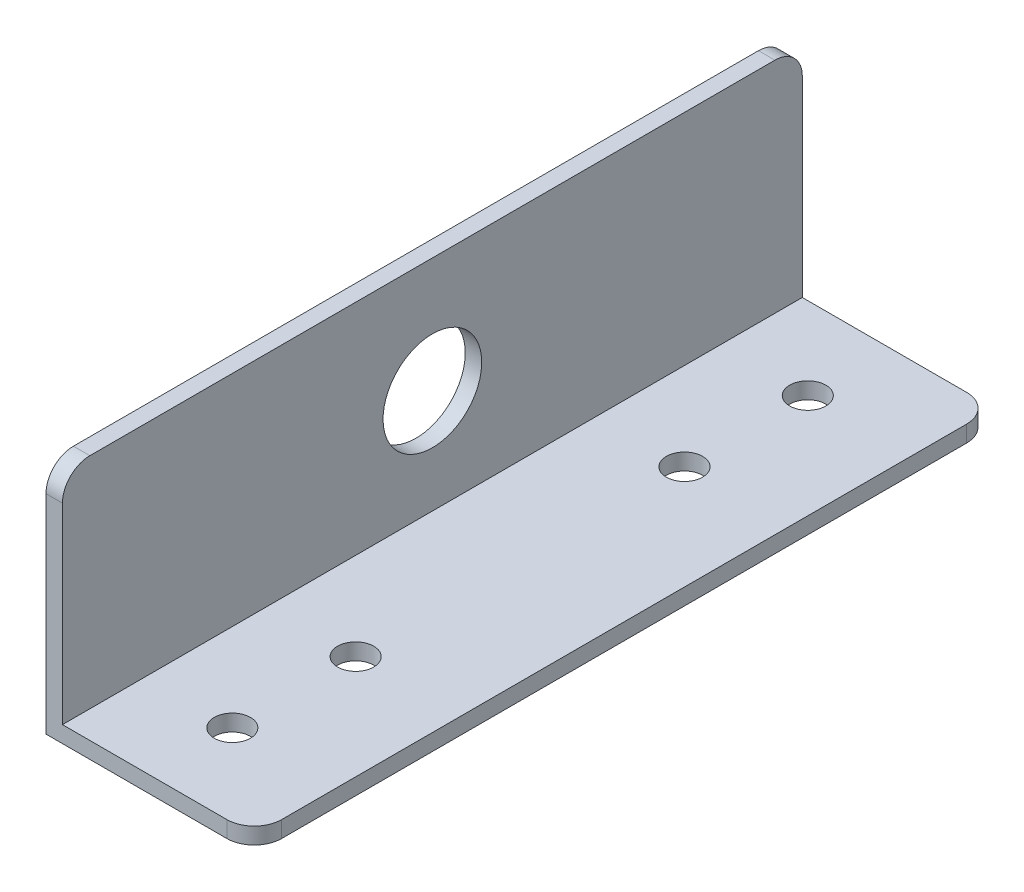
ISO-10303-21;
HEADER;
FILE_DESCRIPTION(('STEP AP214'),'2;1');
FILE_NAME('part.step','',(''),(''),'','','');
FILE_SCHEMA(('AUTOMOTIVE_DESIGN { 1 0 10303 214 1 1 1 1 }'));
ENDSEC;
DATA;
#1=APPLICATION_CONTEXT('core data for automotive mechanical design processes');
#2=APPLICATION_PROTOCOL_DEFINITION('international standard','automotive_design',2000,#1);
#3=PRODUCT_CONTEXT('',#1,'mechanical');
#4=PRODUCT('Part','Part','',(#3));
#5=PRODUCT_RELATED_PRODUCT_CATEGORY('part','',(#4));
#6=PRODUCT_DEFINITION_FORMATION('','',#4);
#7=PRODUCT_DEFINITION_CONTEXT('part definition',#1,'design');
#8=PRODUCT_DEFINITION('design','',#6,#7);
#9=PRODUCT_DEFINITION_SHAPE('','',#8);
#10=(LENGTH_UNIT() NAMED_UNIT(*) SI_UNIT(.MILLI.,.METRE.));
#11=(NAMED_UNIT(*) PLANE_ANGLE_UNIT() SI_UNIT($,.RADIAN.));
#12=(NAMED_UNIT(*) SI_UNIT($,.STERADIAN.) SOLID_ANGLE_UNIT());
#13=UNCERTAINTY_MEASURE_WITH_UNIT(LENGTH_MEASURE(1.E-05),#10,'distance_accuracy_value','');
#14=(GEOMETRIC_REPRESENTATION_CONTEXT(3) GLOBAL_UNCERTAINTY_ASSIGNED_CONTEXT((#13)) GLOBAL_UNIT_ASSIGNED_CONTEXT((#10,
#11,#12)) REPRESENTATION_CONTEXT('',''));
#15=CARTESIAN_POINT('',(0.,0.,0.));
#16=DIRECTION('',(0.,0.,1.));
#17=DIRECTION('',(1.,0.,0.));
#18=AXIS2_PLACEMENT_3D('',#15,#16,#17);
#19=CARTESIAN_POINT('',(0.,86.,135.));
#20=DIRECTION('',(1.,0.,0.));
#21=DIRECTION('',(0.,1.,0.));
#22=AXIS2_PLACEMENT_3D('',#19,#20,#21);
#23=PLANE('',#22);
#24=CARTESIAN_POINT('',(0.,44.,0.));
#25=DIRECTION('',(1.,0.,0.));
#26=DIRECTION('',(0.,1.,0.));
#27=AXIS2_PLACEMENT_3D('',#24,#25,#26);
#28=CIRCLE('',#27,18.);
#29=CARTESIAN_POINT('',(0.,62.,0.));
#30=VERTEX_POINT('',#29);
#31=EDGE_CURVE('E243',#30,#30,#28,.T.);
#32=ORIENTED_EDGE('',*,*,#31,.T.);
#33=EDGE_LOOP('',(#32));
#34=FACE_BOUND('',#33,.T.);
#35=DIRECTION('',(0.,-1.,0.));
#36=VECTOR('',#35,1.);
#37=CARTESIAN_POINT('',(0.,86.,135.));
#38=LINE('',#37,#36);
#39=CARTESIAN_POINT('',(0.,76.,135.));
#40=VERTEX_POINT('',#39);
#41=CARTESIAN_POINT('',(0.,0.,135.));
#42=VERTEX_POINT('',#41);
#43=EDGE_CURVE('E125',#40,#42,#38,.T.);
#44=ORIENTED_EDGE('',*,*,#43,.F.);
#45=CARTESIAN_POINT('',(0.,76.,125.));
#46=DIRECTION('',(1.,0.,0.));
#47=DIRECTION('',(0.,1.,0.));
#48=AXIS2_PLACEMENT_3D('',#45,#46,#47);
#49=CIRCLE('',#48,10.);
#50=CARTESIAN_POINT('',(0.,86.,125.));
#51=VERTEX_POINT('',#50);
#52=EDGE_CURVE('E188',#40,#51,#49,.F.);
#53=ORIENTED_EDGE('',*,*,#52,.T.);
#54=DIRECTION('',(0.,0.,-1.));
#55=VECTOR('',#54,1.);
#56=CARTESIAN_POINT('',(0.,86.,135.));
#57=LINE('',#56,#55);
#58=CARTESIAN_POINT('',(0.,86.,-125.));
#59=VERTEX_POINT('',#58);
#60=EDGE_CURVE('E232',#51,#59,#57,.T.);
#61=ORIENTED_EDGE('',*,*,#60,.T.);
#62=CARTESIAN_POINT('',(0.,76.,-125.));
#63=DIRECTION('',(1.,0.,0.));
#64=DIRECTION('',(0.,1.,0.));
#65=AXIS2_PLACEMENT_3D('',#62,#63,#64);
#66=CIRCLE('',#65,10.);
#67=CARTESIAN_POINT('',(0.,76.,-135.));
#68=VERTEX_POINT('',#67);
#69=EDGE_CURVE('E185',#59,#68,#66,.F.);
#70=ORIENTED_EDGE('',*,*,#69,.T.);
#71=DIRECTION('',(0.,-1.,0.));
#72=VECTOR('',#71,1.);
#73=CARTESIAN_POINT('',(0.,86.,-135.));
#74=LINE('',#73,#72);
#75=CARTESIAN_POINT('',(0.,0.,-135.));
#76=VERTEX_POINT('',#75);
#77=EDGE_CURVE('E150',#68,#76,#74,.T.);
#78=ORIENTED_EDGE('',*,*,#77,.T.);
#79=DIRECTION('',(0.,0.,-1.));
#80=VECTOR('',#79,1.);
#81=CARTESIAN_POINT('',(0.,0.,135.));
#82=LINE('',#81,#80);
#83=EDGE_CURVE('E144',#42,#76,#82,.T.);
#84=ORIENTED_EDGE('',*,*,#83,.F.);
#85=EDGE_LOOP('',(#44,#53,#61,#70,#78,#84));
#86=FACE_BOUND('',#85,.T.);
#87=ADVANCED_FACE('F45',(#34,#86),#23,.F.);
#88=CARTESIAN_POINT('',(0.,0.,135.));
#89=DIRECTION('',(0.,1.,0.));
#90=DIRECTION('',(0.,0.,1.));
#91=AXIS2_PLACEMENT_3D('',#88,#89,#90);
#92=PLANE('',#91);
#93=CARTESIAN_POINT('',(37.9999999999999,0.,105.));
#94=DIRECTION('',(0.,1.,0.));
#95=DIRECTION('',(1.,0.,0.));
#96=AXIS2_PLACEMENT_3D('',#93,#94,#95);
#97=CIRCLE('',#96,6.6);
#98=CARTESIAN_POINT('',(44.5999999999999,0.,105.));
#99=VERTEX_POINT('',#98);
#100=EDGE_CURVE('E268',#99,#99,#97,.T.);
#101=ORIENTED_EDGE('',*,*,#100,.T.);
#102=EDGE_LOOP('',(#101));
#103=FACE_BOUND('',#102,.T.);
#104=CARTESIAN_POINT('',(37.9999999999999,0.,60.));
#105=DIRECTION('',(0.,1.,0.));
#106=DIRECTION('',(-1.,0.,0.));
#107=AXIS2_PLACEMENT_3D('',#104,#105,#106);
#108=CIRCLE('',#107,6.6);
#109=CARTESIAN_POINT('',(31.3999999999999,0.,60.));
#110=VERTEX_POINT('',#109);
#111=EDGE_CURVE('E276',#110,#110,#108,.T.);
#112=ORIENTED_EDGE('',*,*,#111,.T.);
#113=EDGE_LOOP('',(#112));
#114=FACE_BOUND('',#113,.T.);
#115=CARTESIAN_POINT('',(37.9999999999999,0.,-105.));
#116=DIRECTION('',(0.,1.,0.));
#117=DIRECTION('',(-1.,0.,0.));
#118=AXIS2_PLACEMENT_3D('',#115,#116,#117);
#119=CIRCLE('',#118,6.6);
#120=CARTESIAN_POINT('',(31.3999999999999,0.,-105.));
#121=VERTEX_POINT('',#120);
#122=EDGE_CURVE('E260',#121,#121,#119,.T.);
#123=ORIENTED_EDGE('',*,*,#122,.T.);
#124=EDGE_LOOP('',(#123));
#125=FACE_BOUND('',#124,.T.);
#126=CARTESIAN_POINT('',(37.9999999999999,0.,-60.));
#127=DIRECTION('',(0.,1.,0.));
#128=DIRECTION('',(1.,0.,0.));
#129=AXIS2_PLACEMENT_3D('',#126,#127,#128);
#130=CIRCLE('',#129,6.6);
#131=CARTESIAN_POINT('',(44.5999999999999,0.,-60.));
#132=VERTEX_POINT('',#131);
#133=EDGE_CURVE('E252',#132,#132,#130,.T.);
#134=ORIENTED_EDGE('',*,*,#133,.T.);
#135=EDGE_LOOP('',(#134));
#136=FACE_BOUND('',#135,.T.);
#137=DIRECTION('',(0.,0.,-1.));
#138=VECTOR('',#137,1.);
#139=CARTESIAN_POINT('',(76.,0.,135.));
#140=LINE('',#139,#138);
#141=CARTESIAN_POINT('',(76.,0.,125.));
#142=VERTEX_POINT('',#141);
#143=CARTESIAN_POINT('',(76.,0.,-125.));
#144=VERTEX_POINT('',#143);
#145=EDGE_CURVE('E153',#142,#144,#140,.T.);
#146=ORIENTED_EDGE('',*,*,#145,.F.);
#147=CARTESIAN_POINT('',(66.,0.,125.));
#148=DIRECTION('',(0.,1.,0.));
#149=DIRECTION('',(0.,0.,1.));
#150=AXIS2_PLACEMENT_3D('',#147,#148,#149);
#151=CIRCLE('',#150,10.);
#152=CARTESIAN_POINT('',(66.,0.,135.));
#153=VERTEX_POINT('',#152);
#154=EDGE_CURVE('E146',#142,#153,#151,.F.);
#155=ORIENTED_EDGE('',*,*,#154,.T.);
#156=DIRECTION('',(1.,0.,0.));
#157=VECTOR('',#156,1.);
#158=CARTESIAN_POINT('',(0.,0.,135.));
#159=LINE('',#158,#157);
#160=EDGE_CURVE('E129',#42,#153,#159,.T.);
#161=ORIENTED_EDGE('',*,*,#160,.F.);
#162=ORIENTED_EDGE('',*,*,#83,.T.);
#163=DIRECTION('',(1.,0.,0.));
#164=VECTOR('',#163,1.);
#165=CARTESIAN_POINT('',(0.,0.,-135.));
#166=LINE('',#165,#164);
#167=CARTESIAN_POINT('',(66.,0.,-135.));
#168=VERTEX_POINT('',#167);
#169=EDGE_CURVE('E207',#76,#168,#166,.T.);
#170=ORIENTED_EDGE('',*,*,#169,.T.);
#171=CARTESIAN_POINT('',(66.,0.,-125.));
#172=DIRECTION('',(0.,1.,0.));
#173=DIRECTION('',(0.,0.,1.));
#174=AXIS2_PLACEMENT_3D('',#171,#172,#173);
#175=CIRCLE('',#174,10.);
#176=EDGE_CURVE('E180',#168,#144,#175,.F.);
#177=ORIENTED_EDGE('',*,*,#176,.T.);
#178=EDGE_LOOP('',(#146,#155,#161,#162,#170,#177));
#179=FACE_BOUND('',#178,.T.);
#180=ADVANCED_FACE('F142',(#103,#114,#125,#136,#179),#92,.F.);
#181=CARTESIAN_POINT('',(76.,0.,135.));
#182=DIRECTION('',(-1.,0.,0.));
#183=DIRECTION('',(0.,0.,1.));
#184=AXIS2_PLACEMENT_3D('',#181,#182,#183);
#185=PLANE('',#184);
#186=DIRECTION('',(0.,0.,-1.));
#187=VECTOR('',#186,1.);
#188=CARTESIAN_POINT('',(76.,6.,135.));
#189=LINE('',#188,#187);
#190=CARTESIAN_POINT('',(76.,6.,125.));
#191=VERTEX_POINT('',#190);
#192=CARTESIAN_POINT('',(76.,6.,-125.));
#193=VERTEX_POINT('',#192);
#194=EDGE_CURVE('E161',#191,#193,#189,.T.);
#195=ORIENTED_EDGE('',*,*,#194,.F.);
#196=DIRECTION('',(0.,1.,0.));
#197=VECTOR('',#196,1.);
#198=CARTESIAN_POINT('',(76.,0.,125.));
#199=LINE('',#198,#197);
#200=EDGE_CURVE('E177',#191,#142,#199,.F.);
#201=ORIENTED_EDGE('',*,*,#200,.T.);
#202=ORIENTED_EDGE('',*,*,#145,.T.);
#203=DIRECTION('',(0.,1.,0.));
#204=VECTOR('',#203,1.);
#205=CARTESIAN_POINT('',(76.,0.,-125.));
#206=LINE('',#205,#204);
#207=EDGE_CURVE('E173',#144,#193,#206,.T.);
#208=ORIENTED_EDGE('',*,*,#207,.T.);
#209=EDGE_LOOP('',(#195,#201,#202,#208));
#210=FACE_BOUND('',#209,.T.);
#211=ADVANCED_FACE('F217',(#210),#185,.F.);
#212=CARTESIAN_POINT('',(76.,6.,135.));
#213=DIRECTION('',(0.,-1.,0.));
#214=DIRECTION('',(1.,0.,0.));
#215=AXIS2_PLACEMENT_3D('',#212,#213,#214);
#216=PLANE('',#215);
#217=CARTESIAN_POINT('',(37.9999999999999,6.,105.));
#218=DIRECTION('',(0.,1.,0.));
#219=DIRECTION('',(1.,0.,0.));
#220=AXIS2_PLACEMENT_3D('',#217,#218,#219);
#221=CIRCLE('',#220,6.6);
#222=CARTESIAN_POINT('',(44.5999999999999,6.,105.));
#223=VERTEX_POINT('',#222);
#224=EDGE_CURVE('E264',#223,#223,#221,.T.);
#225=ORIENTED_EDGE('',*,*,#224,.F.);
#226=EDGE_LOOP('',(#225));
#227=FACE_BOUND('',#226,.T.);
#228=CARTESIAN_POINT('',(37.9999999999999,6.,60.));
#229=DIRECTION('',(0.,1.,0.));
#230=DIRECTION('',(-1.,0.,0.));
#231=AXIS2_PLACEMENT_3D('',#228,#229,#230);
#232=CIRCLE('',#231,6.6);
#233=CARTESIAN_POINT('',(31.3999999999999,6.,60.));
#234=VERTEX_POINT('',#233);
#235=EDGE_CURVE('E272',#234,#234,#232,.T.);
#236=ORIENTED_EDGE('',*,*,#235,.F.);
#237=EDGE_LOOP('',(#236));
#238=FACE_BOUND('',#237,.T.);
#239=CARTESIAN_POINT('',(37.9999999999999,6.,-105.));
#240=DIRECTION('',(0.,1.,0.));
#241=DIRECTION('',(-1.,0.,0.));
#242=AXIS2_PLACEMENT_3D('',#239,#240,#241);
#243=CIRCLE('',#242,6.6);
#244=CARTESIAN_POINT('',(31.3999999999999,6.,-105.));
#245=VERTEX_POINT('',#244);
#246=EDGE_CURVE('E280',#245,#245,#243,.T.);
#247=ORIENTED_EDGE('',*,*,#246,.F.);
#248=EDGE_LOOP('',(#247));
#249=FACE_BOUND('',#248,.T.);
#250=CARTESIAN_POINT('',(37.9999999999999,6.,-60.));
#251=DIRECTION('',(0.,1.,0.));
#252=DIRECTION('',(1.,0.,0.));
#253=AXIS2_PLACEMENT_3D('',#250,#251,#252);
#254=CIRCLE('',#253,6.6);
#255=CARTESIAN_POINT('',(44.5999999999999,6.,-60.));
#256=VERTEX_POINT('',#255);
#257=EDGE_CURVE('E256',#256,#256,#254,.T.);
#258=ORIENTED_EDGE('',*,*,#257,.F.);
#259=EDGE_LOOP('',(#258));
#260=FACE_BOUND('',#259,.T.);
#261=DIRECTION('',(-1.,0.,0.));
#262=VECTOR('',#261,1.);
#263=CARTESIAN_POINT('',(76.,6.,135.));
#264=LINE('',#263,#262);
#265=CARTESIAN_POINT('',(66.,6.,135.));
#266=VERTEX_POINT('',#265);
#267=CARTESIAN_POINT('',(6.,5.99999999999999,135.));
#268=VERTEX_POINT('',#267);
#269=EDGE_CURVE('E148',#266,#268,#264,.T.);
#270=ORIENTED_EDGE('',*,*,#269,.F.);
#271=CARTESIAN_POINT('',(66.,6.,125.));
#272=DIRECTION('',(0.,-1.,0.));
#273=DIRECTION('',(1.,0.,0.));
#274=AXIS2_PLACEMENT_3D('',#271,#272,#273);
#275=CIRCLE('',#274,10.);
#276=EDGE_CURVE('E170',#266,#191,#275,.F.);
#277=ORIENTED_EDGE('',*,*,#276,.T.);
#278=ORIENTED_EDGE('',*,*,#194,.T.);
#279=CARTESIAN_POINT('',(66.,6.,-125.));
#280=DIRECTION('',(0.,-1.,0.));
#281=DIRECTION('',(1.,0.,0.));
#282=AXIS2_PLACEMENT_3D('',#279,#280,#281);
#283=CIRCLE('',#282,10.);
#284=CARTESIAN_POINT('',(66.,6.,-135.));
#285=VERTEX_POINT('',#284);
#286=EDGE_CURVE('E167',#193,#285,#283,.F.);
#287=ORIENTED_EDGE('',*,*,#286,.T.);
#288=DIRECTION('',(-1.,0.,0.));
#289=VECTOR('',#288,1.);
#290=CARTESIAN_POINT('',(76.,6.,-135.));
#291=LINE('',#290,#289);
#292=CARTESIAN_POINT('',(6.,5.99999999999999,-135.));
#293=VERTEX_POINT('',#292);
#294=EDGE_CURVE('E208',#285,#293,#291,.T.);
#295=ORIENTED_EDGE('',*,*,#294,.T.);
#296=DIRECTION('',(0.,0.,-1.));
#297=VECTOR('',#296,1.);
#298=CARTESIAN_POINT('',(6.,5.99999999999999,135.));
#299=LINE('',#298,#297);
#300=EDGE_CURVE('E223',#268,#293,#299,.T.);
#301=ORIENTED_EDGE('',*,*,#300,.F.);
#302=EDGE_LOOP('',(#270,#277,#278,#287,#295,#301));
#303=FACE_BOUND('',#302,.T.);
#304=ADVANCED_FACE('F221',(#227,#238,#249,#260,#303),#216,.F.);
#305=CARTESIAN_POINT('',(6.,5.99999999999999,135.));
#306=DIRECTION('',(-1.,0.,0.));
#307=DIRECTION('',(0.,-1.,0.));
#308=AXIS2_PLACEMENT_3D('',#305,#306,#307);
#309=PLANE('',#308);
#310=CARTESIAN_POINT('',(6.,44.,0.));
#311=DIRECTION('',(1.,0.,0.));
#312=DIRECTION('',(0.,1.,0.));
#313=AXIS2_PLACEMENT_3D('',#310,#311,#312);
#314=CIRCLE('',#313,18.);
#315=CARTESIAN_POINT('',(6.,62.,0.));
#316=VERTEX_POINT('',#315);
#317=EDGE_CURVE('E248',#316,#316,#314,.T.);
#318=ORIENTED_EDGE('',*,*,#317,.F.);
#319=EDGE_LOOP('',(#318));
#320=FACE_BOUND('',#319,.T.);
#321=DIRECTION('',(0.,0.,-1.));
#322=VECTOR('',#321,1.);
#323=CARTESIAN_POINT('',(6.,86.,135.));
#324=LINE('',#323,#322);
#325=CARTESIAN_POINT('',(6.,86.,125.));
#326=VERTEX_POINT('',#325);
#327=CARTESIAN_POINT('',(6.,86.,-125.));
#328=VERTEX_POINT('',#327);
#329=EDGE_CURVE('E227',#326,#328,#324,.T.);
#330=ORIENTED_EDGE('',*,*,#329,.F.);
#331=CARTESIAN_POINT('',(6.,76.,125.));
#332=DIRECTION('',(-1.,0.,0.));
#333=DIRECTION('',(0.,-1.,0.));
#334=AXIS2_PLACEMENT_3D('',#331,#332,#333);
#335=CIRCLE('',#334,10.);
#336=CARTESIAN_POINT('',(6.,76.,135.));
#337=VERTEX_POINT('',#336);
#338=EDGE_CURVE('E200',#326,#337,#335,.F.);
#339=ORIENTED_EDGE('',*,*,#338,.T.);
#340=DIRECTION('',(0.,1.,0.));
#341=VECTOR('',#340,1.);
#342=CARTESIAN_POINT('',(6.,5.99999999999999,135.));
#343=LINE('',#342,#341);
#344=EDGE_CURVE('E236',#268,#337,#343,.T.);
#345=ORIENTED_EDGE('',*,*,#344,.F.);
#346=ORIENTED_EDGE('',*,*,#300,.T.);
#347=DIRECTION('',(0.,1.,0.));
#348=VECTOR('',#347,1.);
#349=CARTESIAN_POINT('',(6.,5.99999999999999,-135.));
#350=LINE('',#349,#348);
#351=CARTESIAN_POINT('',(6.,76.,-135.));
#352=VERTEX_POINT('',#351);
#353=EDGE_CURVE('E137',#293,#352,#350,.T.);
#354=ORIENTED_EDGE('',*,*,#353,.T.);
#355=CARTESIAN_POINT('',(6.,76.,-125.));
#356=DIRECTION('',(-1.,0.,0.));
#357=DIRECTION('',(0.,-1.,0.));
#358=AXIS2_PLACEMENT_3D('',#355,#356,#357);
#359=CIRCLE('',#358,10.);
#360=EDGE_CURVE('E66',#352,#328,#359,.F.);
#361=ORIENTED_EDGE('',*,*,#360,.T.);
#362=EDGE_LOOP('',(#330,#339,#345,#346,#354,#361));
#363=FACE_BOUND('',#362,.T.);
#364=ADVANCED_FACE('F301',(#320,#363),#309,.F.);
#365=CARTESIAN_POINT('',(6.,86.,135.));
#366=DIRECTION('',(0.,-1.,0.));
#367=DIRECTION('',(0.,0.,-1.));
#368=AXIS2_PLACEMENT_3D('',#365,#366,#367);
#369=PLANE('',#368);
#370=ORIENTED_EDGE('',*,*,#60,.F.);
#371=DIRECTION('',(-1.,0.,0.));
#372=VECTOR('',#371,1.);
#373=CARTESIAN_POINT('',(6.,86.,125.));
#374=LINE('',#373,#372);
#375=EDGE_CURVE('E195',#51,#326,#374,.F.);
#376=ORIENTED_EDGE('',*,*,#375,.T.);
#377=ORIENTED_EDGE('',*,*,#329,.T.);
#378=DIRECTION('',(-1.,0.,0.));
#379=VECTOR('',#378,1.);
#380=CARTESIAN_POINT('',(6.,86.,-125.));
#381=LINE('',#380,#379);
#382=EDGE_CURVE('E191',#328,#59,#381,.T.);
#383=ORIENTED_EDGE('',*,*,#382,.T.);
#384=EDGE_LOOP('',(#370,#376,#377,#383));
#385=FACE_BOUND('',#384,.T.);
#386=ADVANCED_FACE('F345',(#385),#369,.F.);
#387=CARTESIAN_POINT('',(0.,0.,135.));
#388=DIRECTION('',(0.,0.,1.));
#389=DIRECTION('',(1.,0.,0.));
#390=AXIS2_PLACEMENT_3D('',#387,#388,#389);
#391=PLANE('',#390);
#392=ORIENTED_EDGE('',*,*,#160,.T.);
#393=DIRECTION('',(0.,1.,0.));
#394=VECTOR('',#393,1.);
#395=CARTESIAN_POINT('',(66.,6.,135.));
#396=LINE('',#395,#394);
#397=EDGE_CURVE('E158',#153,#266,#396,.T.);
#398=ORIENTED_EDGE('',*,*,#397,.T.);
#399=ORIENTED_EDGE('',*,*,#269,.T.);
#400=ORIENTED_EDGE('',*,*,#344,.T.);
#401=DIRECTION('',(-1.,0.,0.));
#402=VECTOR('',#401,1.);
#403=CARTESIAN_POINT('',(0.,76.,135.));
#404=LINE('',#403,#402);
#405=EDGE_CURVE('E133',#337,#40,#404,.T.);
#406=ORIENTED_EDGE('',*,*,#405,.T.);
#407=ORIENTED_EDGE('',*,*,#43,.T.);
#408=EDGE_LOOP('',(#392,#398,#399,#400,#406,#407));
#409=FACE_BOUND('',#408,.T.);
#410=ADVANCED_FACE('F127',(#409),#391,.T.);
#411=CARTESIAN_POINT('',(0.,0.,-135.));
#412=DIRECTION('',(0.,0.,1.));
#413=DIRECTION('',(1.,0.,0.));
#414=AXIS2_PLACEMENT_3D('',#411,#412,#413);
#415=PLANE('',#414);
#416=ORIENTED_EDGE('',*,*,#77,.F.);
#417=DIRECTION('',(-1.,0.,0.));
#418=VECTOR('',#417,1.);
#419=CARTESIAN_POINT('',(0.,76.,-135.));
#420=LINE('',#419,#418);
#421=EDGE_CURVE('E11',#68,#352,#420,.F.);
#422=ORIENTED_EDGE('',*,*,#421,.T.);
#423=ORIENTED_EDGE('',*,*,#353,.F.);
#424=ORIENTED_EDGE('',*,*,#294,.F.);
#425=DIRECTION('',(0.,1.,0.));
#426=VECTOR('',#425,1.);
#427=CARTESIAN_POINT('',(66.,0.,-135.));
#428=LINE('',#427,#426);
#429=EDGE_CURVE('E54',#285,#168,#428,.F.);
#430=ORIENTED_EDGE('',*,*,#429,.T.);
#431=ORIENTED_EDGE('',*,*,#169,.F.);
#432=EDGE_LOOP('',(#416,#422,#423,#424,#430,#431));
#433=FACE_BOUND('',#432,.T.);
#434=ADVANCED_FACE('F206',(#433),#415,.F.);
#435=CARTESIAN_POINT('',(0.,44.,0.));
#436=DIRECTION('',(1.,0.,0.));
#437=DIRECTION('',(0.,1.,0.));
#438=AXIS2_PLACEMENT_3D('',#435,#436,#437);
#439=CYLINDRICAL_SURFACE('',#438,18.);
#440=ORIENTED_EDGE('',*,*,#31,.F.);
#441=EDGE_LOOP('',(#440));
#442=FACE_BOUND('',#441,.T.);
#443=ORIENTED_EDGE('',*,*,#317,.T.);
#444=EDGE_LOOP('',(#443));
#445=FACE_BOUND('',#444,.T.);
#446=ADVANCED_FACE('F307',(#442,#445),#439,.F.);
#447=CARTESIAN_POINT('',(37.9999999999999,0.,-60.));
#448=DIRECTION('',(0.,1.,0.));
#449=DIRECTION('',(-1.,0.,0.));
#450=AXIS2_PLACEMENT_3D('',#447,#448,#449);
#451=CYLINDRICAL_SURFACE('',#450,6.6);
#452=ORIENTED_EDGE('',*,*,#133,.F.);
#453=EDGE_LOOP('',(#452));
#454=FACE_BOUND('',#453,.T.);
#455=ORIENTED_EDGE('',*,*,#257,.T.);
#456=EDGE_LOOP('',(#455));
#457=FACE_BOUND('',#456,.T.);
#458=ADVANCED_FACE('F295',(#454,#457),#451,.F.);
#459=CARTESIAN_POINT('',(37.9999999999999,0.,-105.));
#460=DIRECTION('',(0.,1.,0.));
#461=DIRECTION('',(-1.,0.,0.));
#462=AXIS2_PLACEMENT_3D('',#459,#460,#461);
#463=CYLINDRICAL_SURFACE('',#462,6.6);
#464=ORIENTED_EDGE('',*,*,#122,.F.);
#465=EDGE_LOOP('',(#464));
#466=FACE_BOUND('',#465,.T.);
#467=ORIENTED_EDGE('',*,*,#246,.T.);
#468=EDGE_LOOP('',(#467));
#469=FACE_BOUND('',#468,.T.);
#470=ADVANCED_FACE('F291',(#466,#469),#463,.F.);
#471=CARTESIAN_POINT('',(37.9999999999999,0.,60.));
#472=DIRECTION('',(0.,1.,0.));
#473=DIRECTION('',(-1.,0.,0.));
#474=AXIS2_PLACEMENT_3D('',#471,#472,#473);
#475=CYLINDRICAL_SURFACE('',#474,6.6);
#476=ORIENTED_EDGE('',*,*,#111,.F.);
#477=EDGE_LOOP('',(#476));
#478=FACE_BOUND('',#477,.T.);
#479=ORIENTED_EDGE('',*,*,#235,.T.);
#480=EDGE_LOOP('',(#479));
#481=FACE_BOUND('',#480,.T.);
#482=ADVANCED_FACE('F294',(#478,#481),#475,.F.);
#483=CARTESIAN_POINT('',(37.9999999999999,0.,105.));
#484=DIRECTION('',(0.,1.,0.));
#485=DIRECTION('',(-1.,0.,0.));
#486=AXIS2_PLACEMENT_3D('',#483,#484,#485);
#487=CYLINDRICAL_SURFACE('',#486,6.6);
#488=ORIENTED_EDGE('',*,*,#100,.F.);
#489=EDGE_LOOP('',(#488));
#490=FACE_BOUND('',#489,.T.);
#491=ORIENTED_EDGE('',*,*,#224,.T.);
#492=EDGE_LOOP('',(#491));
#493=FACE_BOUND('',#492,.T.);
#494=ADVANCED_FACE('F332',(#490,#493),#487,.F.);
#495=CARTESIAN_POINT('',(66.,0.,125.));
#496=DIRECTION('',(0.,-1.,0.));
#497=DIRECTION('',(0.,0.,-1.));
#498=AXIS2_PLACEMENT_3D('',#495,#496,#497);
#499=CYLINDRICAL_SURFACE('',#498,10.);
#500=ORIENTED_EDGE('',*,*,#154,.F.);
#501=ORIENTED_EDGE('',*,*,#200,.F.);
#502=ORIENTED_EDGE('',*,*,#276,.F.);
#503=ORIENTED_EDGE('',*,*,#397,.F.);
#504=EDGE_LOOP('',(#500,#501,#502,#503));
#505=FACE_BOUND('',#504,.T.);
#506=ADVANCED_FACE('F328',(#505),#499,.T.);
#507=CARTESIAN_POINT('',(0.,76.,125.));
#508=DIRECTION('',(1.,0.,0.));
#509=DIRECTION('',(0.,0.,-1.));
#510=AXIS2_PLACEMENT_3D('',#507,#508,#509);
#511=CYLINDRICAL_SURFACE('',#510,10.);
#512=ORIENTED_EDGE('',*,*,#338,.F.);
#513=ORIENTED_EDGE('',*,*,#375,.F.);
#514=ORIENTED_EDGE('',*,*,#52,.F.);
#515=ORIENTED_EDGE('',*,*,#405,.F.);
#516=EDGE_LOOP('',(#512,#513,#514,#515));
#517=FACE_BOUND('',#516,.T.);
#518=ADVANCED_FACE('F331',(#517),#511,.T.);
#519=CARTESIAN_POINT('',(6.,76.,-125.));
#520=DIRECTION('',(-1.,0.,0.));
#521=DIRECTION('',(0.,0.,1.));
#522=AXIS2_PLACEMENT_3D('',#519,#520,#521);
#523=CYLINDRICAL_SURFACE('',#522,10.);
#524=ORIENTED_EDGE('',*,*,#360,.F.);
#525=ORIENTED_EDGE('',*,*,#421,.F.);
#526=ORIENTED_EDGE('',*,*,#69,.F.);
#527=ORIENTED_EDGE('',*,*,#382,.F.);
#528=EDGE_LOOP('',(#524,#525,#526,#527));
#529=FACE_BOUND('',#528,.T.);
#530=ADVANCED_FACE('F335',(#529),#523,.T.);
#531=CARTESIAN_POINT('',(66.,0.,-125.));
#532=DIRECTION('',(0.,1.,0.));
#533=DIRECTION('',(0.,0.,1.));
#534=AXIS2_PLACEMENT_3D('',#531,#532,#533);
#535=CYLINDRICAL_SURFACE('',#534,10.);
#536=ORIENTED_EDGE('',*,*,#176,.F.);
#537=ORIENTED_EDGE('',*,*,#429,.F.);
#538=ORIENTED_EDGE('',*,*,#286,.F.);
#539=ORIENTED_EDGE('',*,*,#207,.F.);
#540=EDGE_LOOP('',(#536,#537,#538,#539));
#541=FACE_BOUND('',#540,.T.);
#542=ADVANCED_FACE('F47',(#541),#535,.T.);
#543=CLOSED_SHELL('',(#87,#180,#211,#304,#364,#386,#410,#434,#446,#458,#470,#482,#494,#506,#518,
#530,#542));
#544=MANIFOLD_SOLID_BREP('B2',#543);
#545=ADVANCED_BREP_SHAPE_REPRESENTATION('',(#18,#544),#14);
#546=SHAPE_DEFINITION_REPRESENTATION(#9,#545);
ENDSEC;
END-ISO-10303-21;
